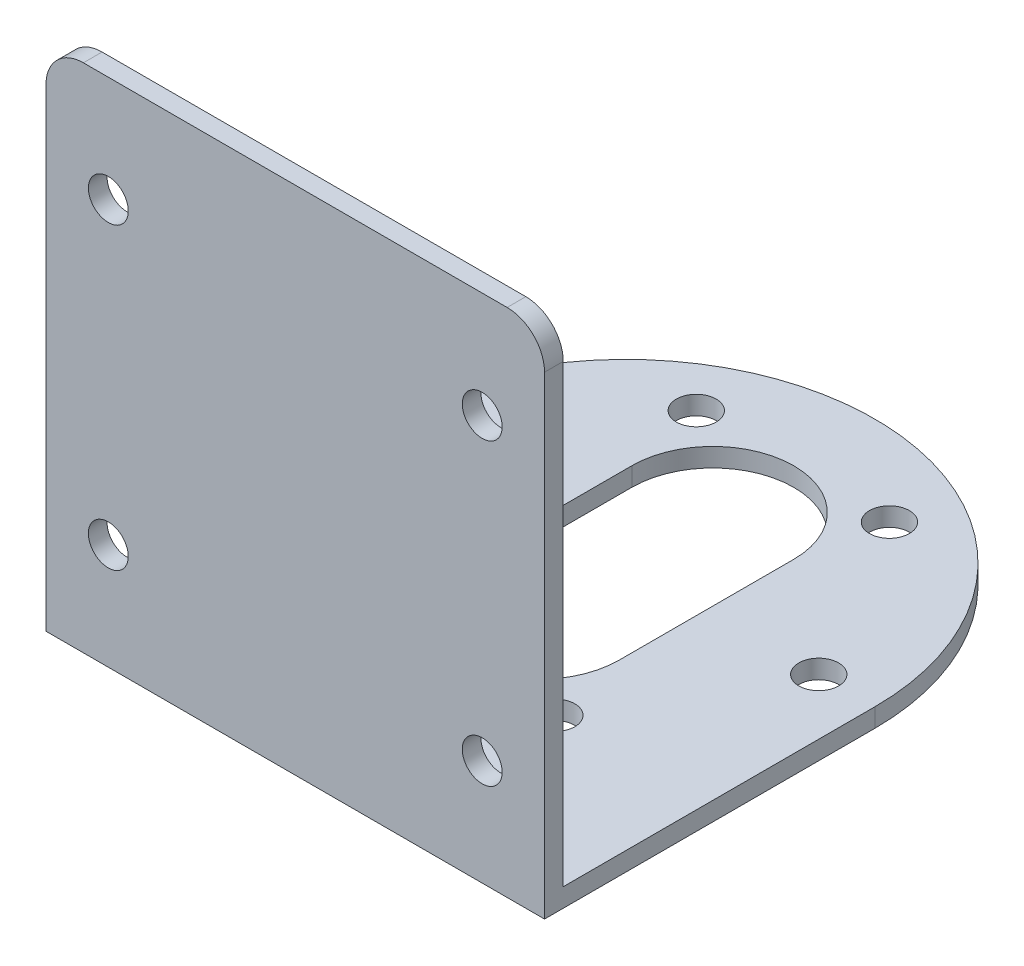
ISO-10303-21;
HEADER;
FILE_DESCRIPTION(('STEP AP214'),'2;1');
FILE_NAME('part.step','',(''),(''),'','','');
FILE_SCHEMA(('AUTOMOTIVE_DESIGN { 1 0 10303 214 1 1 1 1 }'));
ENDSEC;
DATA;
#1=APPLICATION_CONTEXT('core data for automotive mechanical design processes');
#2=APPLICATION_PROTOCOL_DEFINITION('international standard','automotive_design',2000,#1);
#3=PRODUCT_CONTEXT('',#1,'mechanical');
#4=PRODUCT('Part','Part','',(#3));
#5=PRODUCT_RELATED_PRODUCT_CATEGORY('part','',(#4));
#6=PRODUCT_DEFINITION_FORMATION('','',#4);
#7=PRODUCT_DEFINITION_CONTEXT('part definition',#1,'design');
#8=PRODUCT_DEFINITION('design','',#6,#7);
#9=PRODUCT_DEFINITION_SHAPE('','',#8);
#10=(LENGTH_UNIT() NAMED_UNIT(*) SI_UNIT(.MILLI.,.METRE.));
#11=(NAMED_UNIT(*) PLANE_ANGLE_UNIT() SI_UNIT($,.RADIAN.));
#12=(NAMED_UNIT(*) SI_UNIT($,.STERADIAN.) SOLID_ANGLE_UNIT());
#13=UNCERTAINTY_MEASURE_WITH_UNIT(LENGTH_MEASURE(1.E-05),#10,'distance_accuracy_value','');
#14=(GEOMETRIC_REPRESENTATION_CONTEXT(3) GLOBAL_UNCERTAINTY_ASSIGNED_CONTEXT((#13)) GLOBAL_UNIT_ASSIGNED_CONTEXT((#10,
#11,#12)) REPRESENTATION_CONTEXT('',''));
#15=CARTESIAN_POINT('',(0.,0.,0.));
#16=DIRECTION('',(0.,0.,1.));
#17=DIRECTION('',(1.,0.,0.));
#18=AXIS2_PLACEMENT_3D('',#15,#16,#17);
#19=CARTESIAN_POINT('',(0.,1.5,-13.25));
#20=DIRECTION('',(0.,1.,0.));
#21=DIRECTION('',(0.,0.,1.));
#22=AXIS2_PLACEMENT_3D('',#19,#20,#21);
#23=PLANE('',#22);
#24=DIRECTION('',(-1.,0.,0.));
#25=VECTOR('',#24,1.);
#26=CARTESIAN_POINT('',(-20.,1.5,11.75));
#27=LINE('',#26,#25);
#28=CARTESIAN_POINT('',(20.,1.5,11.75));
#29=VERTEX_POINT('',#28);
#30=CARTESIAN_POINT('',(-20.,1.5,11.75));
#31=VERTEX_POINT('',#30);
#32=EDGE_CURVE('E147',#29,#31,#27,.T.);
#33=ORIENTED_EDGE('',*,*,#32,.F.);
#34=DIRECTION('',(0.,0.,-1.));
#35=VECTOR('',#34,1.);
#36=CARTESIAN_POINT('',(20.,1.5,13.25));
#37=LINE('',#36,#35);
#38=CARTESIAN_POINT('',(20.,1.5,-13.25));
#39=VERTEX_POINT('',#38);
#40=EDGE_CURVE('E153',#29,#39,#37,.T.);
#41=ORIENTED_EDGE('',*,*,#40,.T.);
#42=CARTESIAN_POINT('',(0.,1.5,-13.25));
#43=DIRECTION('',(0.,1.,0.));
#44=DIRECTION('',(0.,0.,1.));
#45=AXIS2_PLACEMENT_3D('',#42,#43,#44);
#46=CIRCLE('',#45,20.);
#47=CARTESIAN_POINT('',(-20.,1.5,-13.25));
#48=VERTEX_POINT('',#47);
#49=EDGE_CURVE('E150',#39,#48,#46,.T.);
#50=ORIENTED_EDGE('',*,*,#49,.T.);
#51=DIRECTION('',(0.,0.,1.));
#52=VECTOR('',#51,1.);
#53=CARTESIAN_POINT('',(-20.,1.5,13.25));
#54=LINE('',#53,#52);
#55=EDGE_CURVE('E136',#48,#31,#54,.T.);
#56=ORIENTED_EDGE('',*,*,#55,.T.);
#57=EDGE_LOOP('',(#33,#41,#50,#56));
#58=FACE_BOUND('',#57,.T.);
#59=CARTESIAN_POINT('',(-7.75,1.5,-26.6733937586588));
#60=DIRECTION('',(0.,1.,0.));
#61=DIRECTION('',(0.,0.,1.));
#62=AXIS2_PLACEMENT_3D('',#59,#60,#61);
#63=CIRCLE('',#62,1.6);
#64=CARTESIAN_POINT('',(-7.75,1.5,-25.0733937586588));
#65=VERTEX_POINT('',#64);
#66=EDGE_CURVE('E180',#65,#65,#63,.T.);
#67=ORIENTED_EDGE('',*,*,#66,.F.);
#68=EDGE_LOOP('',(#67));
#69=FACE_BOUND('',#68,.T.);
#70=CARTESIAN_POINT('',(-7.74999999999999,1.5,0.1733937586588));
#71=DIRECTION('',(0.,1.,0.));
#72=DIRECTION('',(0.,0.,1.));
#73=AXIS2_PLACEMENT_3D('',#70,#71,#72);
#74=CIRCLE('',#73,1.6);
#75=CARTESIAN_POINT('',(-7.74999999999999,1.5,1.7733937586588));
#76=VERTEX_POINT('',#75);
#77=EDGE_CURVE('E196',#76,#76,#74,.T.);
#78=ORIENTED_EDGE('',*,*,#77,.F.);
#79=EDGE_LOOP('',(#78));
#80=FACE_BOUND('',#79,.T.);
#81=CARTESIAN_POINT('',(15.5,1.5,-13.25));
#82=DIRECTION('',(0.,1.,0.));
#83=DIRECTION('',(0.,0.,1.));
#84=AXIS2_PLACEMENT_3D('',#81,#82,#83);
#85=CIRCLE('',#84,1.6);
#86=CARTESIAN_POINT('',(15.5,1.5,-11.65));
#87=VERTEX_POINT('',#86);
#88=EDGE_CURVE('E212',#87,#87,#85,.T.);
#89=ORIENTED_EDGE('',*,*,#88,.F.);
#90=EDGE_LOOP('',(#89));
#91=FACE_BOUND('',#90,.T.);
#92=DIRECTION('',(0.,0.,1.));
#93=VECTOR('',#92,1.);
#94=CARTESIAN_POINT('',(-6.5,1.5,-20.25));
#95=LINE('',#94,#93);
#96=CARTESIAN_POINT('',(-6.5,1.5,-20.25));
#97=VERTEX_POINT('',#96);
#98=CARTESIAN_POINT('',(-6.5,1.5,-6.25));
#99=VERTEX_POINT('',#98);
#100=EDGE_CURVE('E223',#97,#99,#95,.T.);
#101=ORIENTED_EDGE('',*,*,#100,.F.);
#102=CARTESIAN_POINT('',(0.,1.5,-20.25));
#103=DIRECTION('',(0.,1.,0.));
#104=DIRECTION('',(0.,0.,1.));
#105=AXIS2_PLACEMENT_3D('',#102,#103,#104);
#106=CIRCLE('',#105,6.5);
#107=CARTESIAN_POINT('',(6.5,1.5,-20.25));
#108=VERTEX_POINT('',#107);
#109=EDGE_CURVE('E220',#108,#97,#106,.T.);
#110=ORIENTED_EDGE('',*,*,#109,.F.);
#111=DIRECTION('',(0.,0.,-1.));
#112=VECTOR('',#111,1.);
#113=CARTESIAN_POINT('',(6.5,1.5,-20.25));
#114=LINE('',#113,#112);
#115=CARTESIAN_POINT('',(6.5,1.5,-6.25));
#116=VERTEX_POINT('',#115);
#117=EDGE_CURVE('E231',#116,#108,#114,.T.);
#118=ORIENTED_EDGE('',*,*,#117,.F.);
#119=CARTESIAN_POINT('',(0.,1.5,-6.25));
#120=DIRECTION('',(0.,1.,0.));
#121=DIRECTION('',(0.,0.,-1.));
#122=AXIS2_PLACEMENT_3D('',#119,#120,#121);
#123=CIRCLE('',#122,6.5);
#124=EDGE_CURVE('E227',#99,#116,#123,.T.);
#125=ORIENTED_EDGE('',*,*,#124,.F.);
#126=EDGE_LOOP('',(#101,#110,#118,#125));
#127=FACE_BOUND('',#126,.T.);
#128=CARTESIAN_POINT('',(7.75000000000001,1.5,0.1733937586588));
#129=DIRECTION('',(0.,1.,0.));
#130=DIRECTION('',(0.,0.,1.));
#131=AXIS2_PLACEMENT_3D('',#128,#129,#130);
#132=CIRCLE('',#131,1.6);
#133=CARTESIAN_POINT('',(7.75000000000001,1.5,1.7733937586588));
#134=VERTEX_POINT('',#133);
#135=EDGE_CURVE('E204',#134,#134,#132,.T.);
#136=ORIENTED_EDGE('',*,*,#135,.F.);
#137=EDGE_LOOP('',(#136));
#138=FACE_BOUND('',#137,.T.);
#139=CARTESIAN_POINT('',(-15.5,1.5,-13.25));
#140=DIRECTION('',(0.,1.,0.));
#141=DIRECTION('',(0.,0.,1.));
#142=AXIS2_PLACEMENT_3D('',#139,#140,#141);
#143=CIRCLE('',#142,1.6);
#144=CARTESIAN_POINT('',(-15.5,1.5,-11.65));
#145=VERTEX_POINT('',#144);
#146=EDGE_CURVE('E188',#145,#145,#143,.T.);
#147=ORIENTED_EDGE('',*,*,#146,.F.);
#148=EDGE_LOOP('',(#147));
#149=FACE_BOUND('',#148,.T.);
#150=CARTESIAN_POINT('',(7.75,1.5,-26.6733937586588));
#151=DIRECTION('',(0.,1.,0.));
#152=DIRECTION('',(0.,0.,1.));
#153=AXIS2_PLACEMENT_3D('',#150,#151,#152);
#154=CIRCLE('',#153,1.6);
#155=CARTESIAN_POINT('',(7.75,1.5,-25.0733937586588));
#156=VERTEX_POINT('',#155);
#157=EDGE_CURVE('E172',#156,#156,#154,.T.);
#158=ORIENTED_EDGE('',*,*,#157,.F.);
#159=EDGE_LOOP('',(#158));
#160=FACE_BOUND('',#159,.T.);
#161=ADVANCED_FACE('F45',(#58,#69,#80,#91,#127,#138,#149,#160),#23,.T.);
#162=CARTESIAN_POINT('',(0.,0.,-13.25));
#163=DIRECTION('',(0.,1.,0.));
#164=DIRECTION('',(0.,0.,1.));
#165=AXIS2_PLACEMENT_3D('',#162,#163,#164);
#166=PLANE('',#165);
#167=CARTESIAN_POINT('',(0.,0.,-13.25));
#168=DIRECTION('',(0.,1.,0.));
#169=DIRECTION('',(0.,0.,1.));
#170=AXIS2_PLACEMENT_3D('',#167,#168,#169);
#171=CIRCLE('',#170,20.);
#172=CARTESIAN_POINT('',(20.,0.,-13.25));
#173=VERTEX_POINT('',#172);
#174=CARTESIAN_POINT('',(-20.,0.,-13.25));
#175=VERTEX_POINT('',#174);
#176=EDGE_CURVE('E262',#173,#175,#171,.T.);
#177=ORIENTED_EDGE('',*,*,#176,.F.);
#178=DIRECTION('',(0.,0.,-1.));
#179=VECTOR('',#178,1.);
#180=CARTESIAN_POINT('',(20.,0.,13.25));
#181=LINE('',#180,#179);
#182=CARTESIAN_POINT('',(20.,0.,13.25));
#183=VERTEX_POINT('',#182);
#184=EDGE_CURVE('E264',#183,#173,#181,.T.);
#185=ORIENTED_EDGE('',*,*,#184,.F.);
#186=DIRECTION('',(1.,0.,0.));
#187=VECTOR('',#186,1.);
#188=CARTESIAN_POINT('',(-20.,0.,13.25));
#189=LINE('',#188,#187);
#190=CARTESIAN_POINT('',(-20.,0.,13.25));
#191=VERTEX_POINT('',#190);
#192=EDGE_CURVE('E276',#191,#183,#189,.T.);
#193=ORIENTED_EDGE('',*,*,#192,.F.);
#194=DIRECTION('',(0.,0.,1.));
#195=VECTOR('',#194,1.);
#196=CARTESIAN_POINT('',(-20.,0.,13.25));
#197=LINE('',#196,#195);
#198=EDGE_CURVE('E272',#175,#191,#197,.T.);
#199=ORIENTED_EDGE('',*,*,#198,.F.);
#200=EDGE_LOOP('',(#177,#185,#193,#199));
#201=FACE_BOUND('',#200,.T.);
#202=CARTESIAN_POINT('',(0.,0.,-20.25));
#203=DIRECTION('',(0.,1.,0.));
#204=DIRECTION('',(0.,0.,1.));
#205=AXIS2_PLACEMENT_3D('',#202,#203,#204);
#206=CIRCLE('',#205,6.5);
#207=CARTESIAN_POINT('',(6.5,0.,-20.25));
#208=VERTEX_POINT('',#207);
#209=CARTESIAN_POINT('',(-6.5,0.,-20.25));
#210=VERTEX_POINT('',#209);
#211=EDGE_CURVE('E216',#208,#210,#206,.T.);
#212=ORIENTED_EDGE('',*,*,#211,.T.);
#213=DIRECTION('',(0.,0.,1.));
#214=VECTOR('',#213,1.);
#215=CARTESIAN_POINT('',(-6.5,0.,-20.25));
#216=LINE('',#215,#214);
#217=CARTESIAN_POINT('',(-6.5,0.,-6.25));
#218=VERTEX_POINT('',#217);
#219=EDGE_CURVE('E238',#210,#218,#216,.T.);
#220=ORIENTED_EDGE('',*,*,#219,.T.);
#221=CARTESIAN_POINT('',(0.,0.,-6.25));
#222=DIRECTION('',(0.,1.,0.));
#223=DIRECTION('',(0.,0.,-1.));
#224=AXIS2_PLACEMENT_3D('',#221,#222,#223);
#225=CIRCLE('',#224,6.5);
#226=CARTESIAN_POINT('',(6.5,0.,-6.25));
#227=VERTEX_POINT('',#226);
#228=EDGE_CURVE('E242',#218,#227,#225,.T.);
#229=ORIENTED_EDGE('',*,*,#228,.T.);
#230=DIRECTION('',(0.,0.,-1.));
#231=VECTOR('',#230,1.);
#232=CARTESIAN_POINT('',(6.5,0.,-20.25));
#233=LINE('',#232,#231);
#234=EDGE_CURVE('E224',#227,#208,#233,.T.);
#235=ORIENTED_EDGE('',*,*,#234,.T.);
#236=EDGE_LOOP('',(#212,#220,#229,#235));
#237=FACE_BOUND('',#236,.T.);
#238=CARTESIAN_POINT('',(15.5,0.,-13.25));
#239=DIRECTION('',(0.,1.,0.));
#240=DIRECTION('',(0.,0.,1.));
#241=AXIS2_PLACEMENT_3D('',#238,#239,#240);
#242=CIRCLE('',#241,1.6);
#243=CARTESIAN_POINT('',(15.5,0.,-11.65));
#244=VERTEX_POINT('',#243);
#245=EDGE_CURVE('E208',#244,#244,#242,.T.);
#246=ORIENTED_EDGE('',*,*,#245,.T.);
#247=EDGE_LOOP('',(#246));
#248=FACE_BOUND('',#247,.T.);
#249=CARTESIAN_POINT('',(7.75000000000001,0.,0.1733937586588));
#250=DIRECTION('',(0.,1.,0.));
#251=DIRECTION('',(0.,0.,1.));
#252=AXIS2_PLACEMENT_3D('',#249,#250,#251);
#253=CIRCLE('',#252,1.6);
#254=CARTESIAN_POINT('',(7.75000000000001,0.,1.7733937586588));
#255=VERTEX_POINT('',#254);
#256=EDGE_CURVE('E200',#255,#255,#253,.T.);
#257=ORIENTED_EDGE('',*,*,#256,.T.);
#258=EDGE_LOOP('',(#257));
#259=FACE_BOUND('',#258,.T.);
#260=CARTESIAN_POINT('',(-7.74999999999999,0.,0.1733937586588));
#261=DIRECTION('',(0.,1.,0.));
#262=DIRECTION('',(0.,0.,1.));
#263=AXIS2_PLACEMENT_3D('',#260,#261,#262);
#264=CIRCLE('',#263,1.6);
#265=CARTESIAN_POINT('',(-7.74999999999999,0.,1.7733937586588));
#266=VERTEX_POINT('',#265);
#267=EDGE_CURVE('E192',#266,#266,#264,.T.);
#268=ORIENTED_EDGE('',*,*,#267,.T.);
#269=EDGE_LOOP('',(#268));
#270=FACE_BOUND('',#269,.T.);
#271=CARTESIAN_POINT('',(-15.5,0.,-13.25));
#272=DIRECTION('',(0.,1.,0.));
#273=DIRECTION('',(0.,0.,1.));
#274=AXIS2_PLACEMENT_3D('',#271,#272,#273);
#275=CIRCLE('',#274,1.6);
#276=CARTESIAN_POINT('',(-15.5,0.,-11.65));
#277=VERTEX_POINT('',#276);
#278=EDGE_CURVE('E184',#277,#277,#275,.T.);
#279=ORIENTED_EDGE('',*,*,#278,.T.);
#280=EDGE_LOOP('',(#279));
#281=FACE_BOUND('',#280,.T.);
#282=CARTESIAN_POINT('',(-7.75,0.,-26.6733937586588));
#283=DIRECTION('',(0.,1.,0.));
#284=DIRECTION('',(0.,0.,1.));
#285=AXIS2_PLACEMENT_3D('',#282,#283,#284);
#286=CIRCLE('',#285,1.6);
#287=CARTESIAN_POINT('',(-7.75,0.,-25.0733937586588));
#288=VERTEX_POINT('',#287);
#289=EDGE_CURVE('E176',#288,#288,#286,.T.);
#290=ORIENTED_EDGE('',*,*,#289,.T.);
#291=EDGE_LOOP('',(#290));
#292=FACE_BOUND('',#291,.T.);
#293=CARTESIAN_POINT('',(7.75,0.,-26.6733937586588));
#294=DIRECTION('',(0.,1.,0.));
#295=DIRECTION('',(0.,0.,1.));
#296=AXIS2_PLACEMENT_3D('',#293,#294,#295);
#297=CIRCLE('',#296,1.6);
#298=CARTESIAN_POINT('',(7.75,0.,-25.0733937586588));
#299=VERTEX_POINT('',#298);
#300=EDGE_CURVE('E171',#299,#299,#297,.T.);
#301=ORIENTED_EDGE('',*,*,#300,.T.);
#302=EDGE_LOOP('',(#301));
#303=FACE_BOUND('',#302,.T.);
#304=ADVANCED_FACE('F327',(#201,#237,#248,#259,#270,#281,#292,#303),#166,.F.);
#305=CARTESIAN_POINT('',(0.,1.5,-13.25));
#306=DIRECTION('',(0.,-1.,0.));
#307=DIRECTION('',(0.,0.,-1.));
#308=AXIS2_PLACEMENT_3D('',#305,#306,#307);
#309=CYLINDRICAL_SURFACE('',#308,20.);
#310=ORIENTED_EDGE('',*,*,#176,.T.);
#311=DIRECTION('',(0.,-1.,0.));
#312=VECTOR('',#311,1.);
#313=CARTESIAN_POINT('',(-20.,1.5,-13.25));
#314=LINE('',#313,#312);
#315=EDGE_CURVE('E291',#48,#175,#314,.T.);
#316=ORIENTED_EDGE('',*,*,#315,.F.);
#317=ORIENTED_EDGE('',*,*,#49,.F.);
#318=DIRECTION('',(0.,-1.,0.));
#319=VECTOR('',#318,1.);
#320=CARTESIAN_POINT('',(20.,1.5,-13.25));
#321=LINE('',#320,#319);
#322=EDGE_CURVE('E268',#39,#173,#321,.T.);
#323=ORIENTED_EDGE('',*,*,#322,.T.);
#324=EDGE_LOOP('',(#310,#316,#317,#323));
#325=FACE_BOUND('',#324,.T.);
#326=ADVANCED_FACE('F337',(#325),#309,.T.);
#327=CARTESIAN_POINT('',(-20.,1.5,13.25));
#328=DIRECTION('',(1.,0.,0.));
#329=DIRECTION('',(0.,0.,-1.));
#330=AXIS2_PLACEMENT_3D('',#327,#328,#329);
#331=PLANE('',#330);
#332=DIRECTION('',(0.,-1.,0.));
#333=VECTOR('',#332,1.);
#334=CARTESIAN_POINT('',(-20.,1.5,13.25));
#335=LINE('',#334,#333);
#336=CARTESIAN_POINT('',(-20.,38.,13.25));
#337=VERTEX_POINT('',#336);
#338=EDGE_CURVE('E288',#337,#191,#335,.T.);
#339=ORIENTED_EDGE('',*,*,#338,.F.);
#340=DIRECTION('',(0.,0.,1.));
#341=VECTOR('',#340,1.);
#342=CARTESIAN_POINT('',(-20.,38.,13.25));
#343=LINE('',#342,#341);
#344=CARTESIAN_POINT('',(-20.,38.,11.75));
#345=VERTEX_POINT('',#344);
#346=EDGE_CURVE('E69',#337,#345,#343,.F.);
#347=ORIENTED_EDGE('',*,*,#346,.T.);
#348=DIRECTION('',(0.,-1.,0.));
#349=VECTOR('',#348,1.);
#350=CARTESIAN_POINT('',(-20.,41.,11.75));
#351=LINE('',#350,#349);
#352=EDGE_CURVE('E132',#345,#31,#351,.T.);
#353=ORIENTED_EDGE('',*,*,#352,.T.);
#354=ORIENTED_EDGE('',*,*,#55,.F.);
#355=ORIENTED_EDGE('',*,*,#315,.T.);
#356=ORIENTED_EDGE('',*,*,#198,.T.);
#357=EDGE_LOOP('',(#339,#347,#353,#354,#355,#356));
#358=FACE_BOUND('',#357,.T.);
#359=ADVANCED_FACE('F134',(#358),#331,.F.);
#360=CARTESIAN_POINT('',(-20.,1.5,13.25));
#361=DIRECTION('',(0.,0.,-1.));
#362=DIRECTION('',(-1.,0.,0.));
#363=AXIS2_PLACEMENT_3D('',#360,#361,#362);
#364=PLANE('',#363);
#365=CARTESIAN_POINT('',(-15.,8.5,13.25));
#366=DIRECTION('',(0.,0.,1.));
#367=DIRECTION('',(-1.,0.,0.));
#368=AXIS2_PLACEMENT_3D('',#365,#366,#367);
#369=CIRCLE('',#368,1.6);
#370=CARTESIAN_POINT('',(-13.4,8.5,13.25));
#371=VERTEX_POINT('',#370);
#372=EDGE_CURVE('E363',#371,#371,#369,.T.);
#373=ORIENTED_EDGE('',*,*,#372,.F.);
#374=EDGE_LOOP('',(#373));
#375=FACE_BOUND('',#374,.T.);
#376=CARTESIAN_POINT('',(15.,8.5,13.25));
#377=DIRECTION('',(0.,0.,1.));
#378=DIRECTION('',(1.,0.,0.));
#379=AXIS2_PLACEMENT_3D('',#376,#377,#378);
#380=CIRCLE('',#379,1.6);
#381=CARTESIAN_POINT('',(16.6,8.5,13.25));
#382=VERTEX_POINT('',#381);
#383=EDGE_CURVE('E367',#382,#382,#380,.T.);
#384=ORIENTED_EDGE('',*,*,#383,.F.);
#385=EDGE_LOOP('',(#384));
#386=FACE_BOUND('',#385,.T.);
#387=CARTESIAN_POINT('',(15.,32.5,13.25));
#388=DIRECTION('',(0.,0.,1.));
#389=DIRECTION('',(-1.,0.,0.));
#390=AXIS2_PLACEMENT_3D('',#387,#388,#389);
#391=CIRCLE('',#390,1.6);
#392=CARTESIAN_POINT('',(16.6,32.5,13.25));
#393=VERTEX_POINT('',#392);
#394=EDGE_CURVE('E371',#393,#393,#391,.T.);
#395=ORIENTED_EDGE('',*,*,#394,.F.);
#396=EDGE_LOOP('',(#395));
#397=FACE_BOUND('',#396,.T.);
#398=CARTESIAN_POINT('',(-15.,32.5,13.25));
#399=DIRECTION('',(0.,0.,1.));
#400=DIRECTION('',(1.,0.,0.));
#401=AXIS2_PLACEMENT_3D('',#398,#399,#400);
#402=CIRCLE('',#401,1.6);
#403=CARTESIAN_POINT('',(-13.4,32.5,13.25));
#404=VERTEX_POINT('',#403);
#405=EDGE_CURVE('E165',#404,#404,#402,.T.);
#406=ORIENTED_EDGE('',*,*,#405,.F.);
#407=EDGE_LOOP('',(#406));
#408=FACE_BOUND('',#407,.T.);
#409=DIRECTION('',(1.,0.,0.));
#410=VECTOR('',#409,1.);
#411=CARTESIAN_POINT('',(-20.,41.,13.25));
#412=LINE('',#411,#410);
#413=CARTESIAN_POINT('',(-17.,41.,13.25));
#414=VERTEX_POINT('',#413);
#415=CARTESIAN_POINT('',(17.,41.,13.25));
#416=VERTEX_POINT('',#415);
#417=EDGE_CURVE('E157',#414,#416,#412,.T.);
#418=ORIENTED_EDGE('',*,*,#417,.F.);
#419=CARTESIAN_POINT('',(-17.,38.,13.25));
#420=DIRECTION('',(0.,0.,-1.));
#421=DIRECTION('',(-1.,0.,0.));
#422=AXIS2_PLACEMENT_3D('',#419,#420,#421);
#423=CIRCLE('',#422,3.);
#424=EDGE_CURVE('E305',#414,#337,#423,.F.);
#425=ORIENTED_EDGE('',*,*,#424,.T.);
#426=ORIENTED_EDGE('',*,*,#338,.T.);
#427=ORIENTED_EDGE('',*,*,#192,.T.);
#428=DIRECTION('',(0.,-1.,0.));
#429=VECTOR('',#428,1.);
#430=CARTESIAN_POINT('',(20.,1.5,13.25));
#431=LINE('',#430,#429);
#432=CARTESIAN_POINT('',(20.,38.,13.25));
#433=VERTEX_POINT('',#432);
#434=EDGE_CURVE('E285',#433,#183,#431,.T.);
#435=ORIENTED_EDGE('',*,*,#434,.F.);
#436=CARTESIAN_POINT('',(17.,38.,13.25));
#437=DIRECTION('',(0.,0.,-1.));
#438=DIRECTION('',(-1.,0.,0.));
#439=AXIS2_PLACEMENT_3D('',#436,#437,#438);
#440=CIRCLE('',#439,3.);
#441=EDGE_CURVE('E302',#433,#416,#440,.F.);
#442=ORIENTED_EDGE('',*,*,#441,.T.);
#443=EDGE_LOOP('',(#418,#425,#426,#427,#435,#442));
#444=FACE_BOUND('',#443,.T.);
#445=ADVANCED_FACE('F322',(#375,#386,#397,#408,#444),#364,.F.);
#446=CARTESIAN_POINT('',(20.,1.5,13.25));
#447=DIRECTION('',(-1.,0.,0.));
#448=DIRECTION('',(0.,0.,1.));
#449=AXIS2_PLACEMENT_3D('',#446,#447,#448);
#450=PLANE('',#449);
#451=DIRECTION('',(0.,-1.,0.));
#452=VECTOR('',#451,1.);
#453=CARTESIAN_POINT('',(20.,41.,11.75));
#454=LINE('',#453,#452);
#455=CARTESIAN_POINT('',(20.,38.,11.75));
#456=VERTEX_POINT('',#455);
#457=EDGE_CURVE('E141',#456,#29,#454,.T.);
#458=ORIENTED_EDGE('',*,*,#457,.F.);
#459=DIRECTION('',(0.,0.,-1.));
#460=VECTOR('',#459,1.);
#461=CARTESIAN_POINT('',(20.,38.,13.25));
#462=LINE('',#461,#460);
#463=EDGE_CURVE('E11',#456,#433,#462,.F.);
#464=ORIENTED_EDGE('',*,*,#463,.T.);
#465=ORIENTED_EDGE('',*,*,#434,.T.);
#466=ORIENTED_EDGE('',*,*,#184,.T.);
#467=ORIENTED_EDGE('',*,*,#322,.F.);
#468=ORIENTED_EDGE('',*,*,#40,.F.);
#469=EDGE_LOOP('',(#458,#464,#465,#466,#467,#468));
#470=FACE_BOUND('',#469,.T.);
#471=ADVANCED_FACE('F334',(#470),#450,.F.);
#472=CARTESIAN_POINT('',(0.,1.5,-20.25));
#473=DIRECTION('',(0.,-1.,0.));
#474=DIRECTION('',(0.,0.,-1.));
#475=AXIS2_PLACEMENT_3D('',#472,#473,#474);
#476=CYLINDRICAL_SURFACE('',#475,6.5);
#477=ORIENTED_EDGE('',*,*,#211,.F.);
#478=DIRECTION('',(0.,-1.,0.));
#479=VECTOR('',#478,1.);
#480=CARTESIAN_POINT('',(6.5,1.5,-20.25));
#481=LINE('',#480,#479);
#482=EDGE_CURVE('E234',#108,#208,#481,.T.);
#483=ORIENTED_EDGE('',*,*,#482,.F.);
#484=ORIENTED_EDGE('',*,*,#109,.T.);
#485=DIRECTION('',(0.,-1.,0.));
#486=VECTOR('',#485,1.);
#487=CARTESIAN_POINT('',(-6.5,1.5,-20.25));
#488=LINE('',#487,#486);
#489=EDGE_CURVE('E258',#97,#210,#488,.T.);
#490=ORIENTED_EDGE('',*,*,#489,.T.);
#491=EDGE_LOOP('',(#477,#483,#484,#490));
#492=FACE_BOUND('',#491,.T.);
#493=ADVANCED_FACE('F351',(#492),#476,.F.);
#494=CARTESIAN_POINT('',(-6.5,1.5,-20.25));
#495=DIRECTION('',(1.,0.,0.));
#496=DIRECTION('',(0.,0.,-1.));
#497=AXIS2_PLACEMENT_3D('',#494,#495,#496);
#498=PLANE('',#497);
#499=ORIENTED_EDGE('',*,*,#219,.F.);
#500=ORIENTED_EDGE('',*,*,#489,.F.);
#501=ORIENTED_EDGE('',*,*,#100,.T.);
#502=DIRECTION('',(0.,-1.,0.));
#503=VECTOR('',#502,1.);
#504=CARTESIAN_POINT('',(-6.5,1.5,-6.25));
#505=LINE('',#504,#503);
#506=EDGE_CURVE('E255',#99,#218,#505,.T.);
#507=ORIENTED_EDGE('',*,*,#506,.T.);
#508=EDGE_LOOP('',(#499,#500,#501,#507));
#509=FACE_BOUND('',#508,.T.);
#510=ADVANCED_FACE('F450',(#509),#498,.T.);
#511=CARTESIAN_POINT('',(0.,1.5,-6.25));
#512=DIRECTION('',(0.,-1.,0.));
#513=DIRECTION('',(0.,0.,-1.));
#514=AXIS2_PLACEMENT_3D('',#511,#512,#513);
#515=CYLINDRICAL_SURFACE('',#514,6.5);
#516=ORIENTED_EDGE('',*,*,#228,.F.);
#517=ORIENTED_EDGE('',*,*,#506,.F.);
#518=ORIENTED_EDGE('',*,*,#124,.T.);
#519=DIRECTION('',(0.,-1.,0.));
#520=VECTOR('',#519,1.);
#521=CARTESIAN_POINT('',(6.5,1.5,-6.25));
#522=LINE('',#521,#520);
#523=EDGE_CURVE('E252',#116,#227,#522,.T.);
#524=ORIENTED_EDGE('',*,*,#523,.T.);
#525=EDGE_LOOP('',(#516,#517,#518,#524));
#526=FACE_BOUND('',#525,.T.);
#527=ADVANCED_FACE('F447',(#526),#515,.F.);
#528=CARTESIAN_POINT('',(6.5,1.5,-20.25));
#529=DIRECTION('',(-1.,0.,0.));
#530=DIRECTION('',(0.,0.,1.));
#531=AXIS2_PLACEMENT_3D('',#528,#529,#530);
#532=PLANE('',#531);
#533=ORIENTED_EDGE('',*,*,#234,.F.);
#534=ORIENTED_EDGE('',*,*,#523,.F.);
#535=ORIENTED_EDGE('',*,*,#117,.T.);
#536=ORIENTED_EDGE('',*,*,#482,.T.);
#537=EDGE_LOOP('',(#533,#534,#535,#536));
#538=FACE_BOUND('',#537,.T.);
#539=ADVANCED_FACE('F443',(#538),#532,.T.);
#540=CARTESIAN_POINT('',(15.5,1.5,-13.25));
#541=DIRECTION('',(0.,-1.,0.));
#542=DIRECTION('',(0.,0.,-1.));
#543=AXIS2_PLACEMENT_3D('',#540,#541,#542);
#544=CYLINDRICAL_SURFACE('',#543,1.6);
#545=ORIENTED_EDGE('',*,*,#88,.T.);
#546=EDGE_LOOP('',(#545));
#547=FACE_BOUND('',#546,.T.);
#548=ORIENTED_EDGE('',*,*,#245,.F.);
#549=EDGE_LOOP('',(#548));
#550=FACE_BOUND('',#549,.T.);
#551=ADVANCED_FACE('F439',(#547,#550),#544,.F.);
#552=CARTESIAN_POINT('',(7.75000000000001,1.5,0.1733937586588));
#553=DIRECTION('',(0.,-1.,0.));
#554=DIRECTION('',(0.,0.,-1.));
#555=AXIS2_PLACEMENT_3D('',#552,#553,#554);
#556=CYLINDRICAL_SURFACE('',#555,1.6);
#557=ORIENTED_EDGE('',*,*,#135,.T.);
#558=EDGE_LOOP('',(#557));
#559=FACE_BOUND('',#558,.T.);
#560=ORIENTED_EDGE('',*,*,#256,.F.);
#561=EDGE_LOOP('',(#560));
#562=FACE_BOUND('',#561,.T.);
#563=ADVANCED_FACE('F435',(#559,#562),#556,.F.);
#564=CARTESIAN_POINT('',(-7.74999999999999,1.5,0.1733937586588));
#565=DIRECTION('',(0.,-1.,0.));
#566=DIRECTION('',(0.,0.,-1.));
#567=AXIS2_PLACEMENT_3D('',#564,#565,#566);
#568=CYLINDRICAL_SURFACE('',#567,1.6);
#569=ORIENTED_EDGE('',*,*,#77,.T.);
#570=EDGE_LOOP('',(#569));
#571=FACE_BOUND('',#570,.T.);
#572=ORIENTED_EDGE('',*,*,#267,.F.);
#573=EDGE_LOOP('',(#572));
#574=FACE_BOUND('',#573,.T.);
#575=ADVANCED_FACE('F431',(#571,#574),#568,.F.);
#576=CARTESIAN_POINT('',(-15.5,1.5,-13.25));
#577=DIRECTION('',(0.,-1.,0.));
#578=DIRECTION('',(0.,0.,-1.));
#579=AXIS2_PLACEMENT_3D('',#576,#577,#578);
#580=CYLINDRICAL_SURFACE('',#579,1.6);
#581=ORIENTED_EDGE('',*,*,#146,.T.);
#582=EDGE_LOOP('',(#581));
#583=FACE_BOUND('',#582,.T.);
#584=ORIENTED_EDGE('',*,*,#278,.F.);
#585=EDGE_LOOP('',(#584));
#586=FACE_BOUND('',#585,.T.);
#587=ADVANCED_FACE('F427',(#583,#586),#580,.F.);
#588=CARTESIAN_POINT('',(-7.75,1.5,-26.6733937586588));
#589=DIRECTION('',(0.,-1.,0.));
#590=DIRECTION('',(0.,0.,-1.));
#591=AXIS2_PLACEMENT_3D('',#588,#589,#590);
#592=CYLINDRICAL_SURFACE('',#591,1.6);
#593=ORIENTED_EDGE('',*,*,#66,.T.);
#594=EDGE_LOOP('',(#593));
#595=FACE_BOUND('',#594,.T.);
#596=ORIENTED_EDGE('',*,*,#289,.F.);
#597=EDGE_LOOP('',(#596));
#598=FACE_BOUND('',#597,.T.);
#599=ADVANCED_FACE('F423',(#595,#598),#592,.F.);
#600=CARTESIAN_POINT('',(7.75,1.5,-26.6733937586588));
#601=DIRECTION('',(0.,-1.,0.));
#602=DIRECTION('',(0.,0.,-1.));
#603=AXIS2_PLACEMENT_3D('',#600,#601,#602);
#604=CYLINDRICAL_SURFACE('',#603,1.6);
#605=ORIENTED_EDGE('',*,*,#157,.T.);
#606=EDGE_LOOP('',(#605));
#607=FACE_BOUND('',#606,.T.);
#608=ORIENTED_EDGE('',*,*,#300,.F.);
#609=EDGE_LOOP('',(#608));
#610=FACE_BOUND('',#609,.T.);
#611=ADVANCED_FACE('F401',(#607,#610),#604,.F.);
#612=CARTESIAN_POINT('',(-20.,41.,11.75));
#613=DIRECTION('',(0.,0.,1.));
#614=DIRECTION('',(1.,0.,0.));
#615=AXIS2_PLACEMENT_3D('',#612,#613,#614);
#616=PLANE('',#615);
#617=CARTESIAN_POINT('',(-15.,8.5,11.75));
#618=DIRECTION('',(0.,0.,1.));
#619=DIRECTION('',(1.,0.,0.));
#620=AXIS2_PLACEMENT_3D('',#617,#618,#619);
#621=CIRCLE('',#620,1.6);
#622=CARTESIAN_POINT('',(-13.4,8.5,11.75));
#623=VERTEX_POINT('',#622);
#624=EDGE_CURVE('E384',#623,#623,#621,.F.);
#625=ORIENTED_EDGE('',*,*,#624,.F.);
#626=EDGE_LOOP('',(#625));
#627=FACE_BOUND('',#626,.T.);
#628=CARTESIAN_POINT('',(15.,8.5,11.75));
#629=DIRECTION('',(0.,0.,1.));
#630=DIRECTION('',(1.,0.,0.));
#631=AXIS2_PLACEMENT_3D('',#628,#629,#630);
#632=CIRCLE('',#631,1.6);
#633=CARTESIAN_POINT('',(16.6,8.5,11.75));
#634=VERTEX_POINT('',#633);
#635=EDGE_CURVE('E383',#634,#634,#632,.F.);
#636=ORIENTED_EDGE('',*,*,#635,.F.);
#637=EDGE_LOOP('',(#636));
#638=FACE_BOUND('',#637,.T.);
#639=CARTESIAN_POINT('',(15.,32.5,11.75));
#640=DIRECTION('',(0.,0.,1.));
#641=DIRECTION('',(1.,0.,0.));
#642=AXIS2_PLACEMENT_3D('',#639,#640,#641);
#643=CIRCLE('',#642,1.6);
#644=CARTESIAN_POINT('',(16.6,32.5,11.75));
#645=VERTEX_POINT('',#644);
#646=EDGE_CURVE('E378',#645,#645,#643,.F.);
#647=ORIENTED_EDGE('',*,*,#646,.F.);
#648=EDGE_LOOP('',(#647));
#649=FACE_BOUND('',#648,.T.);
#650=CARTESIAN_POINT('',(-15.,32.5,11.75));
#651=DIRECTION('',(0.,0.,1.));
#652=DIRECTION('',(1.,0.,0.));
#653=AXIS2_PLACEMENT_3D('',#650,#651,#652);
#654=CIRCLE('',#653,1.6);
#655=CARTESIAN_POINT('',(-13.4,32.5,11.75));
#656=VERTEX_POINT('',#655);
#657=EDGE_CURVE('E158',#656,#656,#654,.F.);
#658=ORIENTED_EDGE('',*,*,#657,.F.);
#659=EDGE_LOOP('',(#658));
#660=FACE_BOUND('',#659,.T.);
#661=ORIENTED_EDGE('',*,*,#352,.F.);
#662=CARTESIAN_POINT('',(-17.,38.,11.75));
#663=DIRECTION('',(0.,0.,1.));
#664=DIRECTION('',(1.,0.,0.));
#665=AXIS2_PLACEMENT_3D('',#662,#663,#664);
#666=CIRCLE('',#665,3.);
#667=CARTESIAN_POINT('',(-17.,41.,11.75));
#668=VERTEX_POINT('',#667);
#669=EDGE_CURVE('E54',#345,#668,#666,.F.);
#670=ORIENTED_EDGE('',*,*,#669,.T.);
#671=DIRECTION('',(-1.,0.,0.));
#672=VECTOR('',#671,1.);
#673=CARTESIAN_POINT('',(-20.,41.,11.75));
#674=LINE('',#673,#672);
#675=CARTESIAN_POINT('',(17.,41.,11.75));
#676=VERTEX_POINT('',#675);
#677=EDGE_CURVE('E142',#676,#668,#674,.T.);
#678=ORIENTED_EDGE('',*,*,#677,.F.);
#679=CARTESIAN_POINT('',(17.,38.,11.75));
#680=DIRECTION('',(0.,0.,1.));
#681=DIRECTION('',(1.,0.,0.));
#682=AXIS2_PLACEMENT_3D('',#679,#680,#681);
#683=CIRCLE('',#682,3.);
#684=EDGE_CURVE('E61',#676,#456,#683,.F.);
#685=ORIENTED_EDGE('',*,*,#684,.T.);
#686=ORIENTED_EDGE('',*,*,#457,.T.);
#687=ORIENTED_EDGE('',*,*,#32,.T.);
#688=EDGE_LOOP('',(#661,#670,#678,#685,#686,#687));
#689=FACE_BOUND('',#688,.T.);
#690=ADVANCED_FACE('F155',(#627,#638,#649,#660,#689),#616,.F.);
#691=CARTESIAN_POINT('',(0.,41.,0.));
#692=DIRECTION('',(0.,-1.,0.));
#693=DIRECTION('',(0.,0.,-1.));
#694=AXIS2_PLACEMENT_3D('',#691,#692,#693);
#695=PLANE('',#694);
#696=ORIENTED_EDGE('',*,*,#677,.T.);
#697=DIRECTION('',(0.,0.,1.));
#698=VECTOR('',#697,1.);
#699=CARTESIAN_POINT('',(-17.,41.,0.));
#700=LINE('',#699,#698);
#701=EDGE_CURVE('E298',#668,#414,#700,.T.);
#702=ORIENTED_EDGE('',*,*,#701,.T.);
#703=ORIENTED_EDGE('',*,*,#417,.T.);
#704=DIRECTION('',(0.,0.,-1.));
#705=VECTOR('',#704,1.);
#706=CARTESIAN_POINT('',(17.,41.,0.));
#707=LINE('',#706,#705);
#708=EDGE_CURVE('E294',#416,#676,#707,.T.);
#709=ORIENTED_EDGE('',*,*,#708,.T.);
#710=EDGE_LOOP('',(#696,#702,#703,#709));
#711=FACE_BOUND('',#710,.T.);
#712=ADVANCED_FACE('F316',(#711),#695,.F.);
#713=CARTESIAN_POINT('',(-15.,32.5,-33.251));
#714=DIRECTION('',(0.,0.,1.));
#715=DIRECTION('',(1.,0.,0.));
#716=AXIS2_PLACEMENT_3D('',#713,#714,#715);
#717=CYLINDRICAL_SURFACE('',#716,1.6);
#718=CARTESIAN_POINT('',(-13.4,32.5,13.25));
#719=CARTESIAN_POINT('',(-13.4,32.5,13.234375));
#720=CARTESIAN_POINT('',(-13.4,32.5,13.21875));
#721=CARTESIAN_POINT('',(-13.4,32.5,13.1875));
#722=CARTESIAN_POINT('',(-13.4,32.5,13.171875));
#723=CARTESIAN_POINT('',(-13.4,32.5,13.140625));
#724=CARTESIAN_POINT('',(-13.4,32.5,13.125));
#725=CARTESIAN_POINT('',(-13.4,32.5,13.09375));
#726=CARTESIAN_POINT('',(-13.4,32.5,13.078125));
#727=CARTESIAN_POINT('',(-13.4,32.5,13.046875));
#728=CARTESIAN_POINT('',(-13.4,32.5,13.03125));
#729=CARTESIAN_POINT('',(-13.4,32.5,13.));
#730=CARTESIAN_POINT('',(-13.4,32.5,12.984375));
#731=CARTESIAN_POINT('',(-13.4,32.5,12.953125));
#732=CARTESIAN_POINT('',(-13.4,32.5,12.9375));
#733=CARTESIAN_POINT('',(-13.4,32.5,12.90625));
#734=CARTESIAN_POINT('',(-13.4,32.5,12.890625));
#735=CARTESIAN_POINT('',(-13.4,32.5,12.859375));
#736=CARTESIAN_POINT('',(-13.4,32.5,12.84375));
#737=CARTESIAN_POINT('',(-13.4,32.5,12.8125));
#738=CARTESIAN_POINT('',(-13.4,32.5,12.796875));
#739=CARTESIAN_POINT('',(-13.4,32.5,12.765625));
#740=CARTESIAN_POINT('',(-13.4,32.5,12.75));
#741=CARTESIAN_POINT('',(-13.4,32.5,12.71875));
#742=CARTESIAN_POINT('',(-13.4,32.5,12.703125));
#743=CARTESIAN_POINT('',(-13.4,32.5,12.671875));
#744=CARTESIAN_POINT('',(-13.4,32.5,12.65625));
#745=CARTESIAN_POINT('',(-13.4,32.5,12.625));
#746=CARTESIAN_POINT('',(-13.4,32.5,12.609375));
#747=CARTESIAN_POINT('',(-13.4,32.5,12.578125));
#748=CARTESIAN_POINT('',(-13.4,32.5,12.5625));
#749=CARTESIAN_POINT('',(-13.4,32.5,12.53125));
#750=CARTESIAN_POINT('',(-13.4,32.5,12.515625));
#751=CARTESIAN_POINT('',(-13.4,32.5,12.484375));
#752=CARTESIAN_POINT('',(-13.4,32.5,12.46875));
#753=CARTESIAN_POINT('',(-13.4,32.5,12.4375));
#754=CARTESIAN_POINT('',(-13.4,32.5,12.421875));
#755=CARTESIAN_POINT('',(-13.4,32.5,12.390625));
#756=CARTESIAN_POINT('',(-13.4,32.5,12.375));
#757=CARTESIAN_POINT('',(-13.4,32.5,12.34375));
#758=CARTESIAN_POINT('',(-13.4,32.5,12.328125));
#759=CARTESIAN_POINT('',(-13.4,32.5,12.296875));
#760=CARTESIAN_POINT('',(-13.4,32.5,12.28125));
#761=CARTESIAN_POINT('',(-13.4,32.5,12.25));
#762=CARTESIAN_POINT('',(-13.4,32.5,12.234375));
#763=CARTESIAN_POINT('',(-13.4,32.5,12.203125));
#764=CARTESIAN_POINT('',(-13.4,32.5,12.1875));
#765=CARTESIAN_POINT('',(-13.4,32.5,12.15625));
#766=CARTESIAN_POINT('',(-13.4,32.5,12.140625));
#767=CARTESIAN_POINT('',(-13.4,32.5,12.109375));
#768=CARTESIAN_POINT('',(-13.4,32.5,12.09375));
#769=CARTESIAN_POINT('',(-13.4,32.5,12.0625));
#770=CARTESIAN_POINT('',(-13.4,32.5,12.046875));
#771=CARTESIAN_POINT('',(-13.4,32.5,12.015625));
#772=CARTESIAN_POINT('',(-13.4,32.5,12.));
#773=CARTESIAN_POINT('',(-13.4,32.5,11.96875));
#774=CARTESIAN_POINT('',(-13.4,32.5,11.953125));
#775=CARTESIAN_POINT('',(-13.4,32.5,11.921875));
#776=CARTESIAN_POINT('',(-13.4,32.5,11.90625));
#777=CARTESIAN_POINT('',(-13.4,32.5,11.875));
#778=CARTESIAN_POINT('',(-13.4,32.5,11.859375));
#779=CARTESIAN_POINT('',(-13.4,32.5,11.828125));
#780=CARTESIAN_POINT('',(-13.4,32.5,11.8125));
#781=CARTESIAN_POINT('',(-13.4,32.5,11.78125));
#782=CARTESIAN_POINT('',(-13.4,32.5,11.765625));
#783=CARTESIAN_POINT('',(-13.4,32.5,11.75));
#784=B_SPLINE_CURVE_WITH_KNOTS('',3,(#718,#719,#720,#721,#722,#723,#724,#725,#726,#727,#728,
#729,#730,#731,#732,#733,#734,#735,#736,#737,#738,#739,#740,#741,#742,#743,#744,#745,#746,#747,
#748,#749,#750,#751,#752,#753,#754,#755,#756,#757,#758,#759,#760,#761,#762,#763,#764,#765,#766,
#767,#768,#769,#770,#771,#772,#773,#774,#775,#776,#777,#778,#779,#780,#781,#782,#783),
.UNSPECIFIED.,.F.,.F.,(4,2,2,2,2,2,2,2,2,2,2,2,2,2,2,2,2,2,2,2,2,2,2,2,2,2,2,2,2,2,2,2,4),(0.,
0.0468750000000018,0.0937500000000036,0.140624999999998,0.1875,0.234375000000002,
0.281249999999997,0.328124999999999,0.375,0.421875000000002,0.468750000000004,0.515624999999999,
0.5625,0.609375000000002,0.656249999999997,0.703124999999999,0.750000000000001,
0.796875000000002,0.843750000000004,0.890624999999999,0.937500000000001,0.984375000000003,
1.03125,1.078125,1.125,1.171875,1.21875,1.265625,1.3125,1.359375,1.40625,1.453125,1.5),.UNSPECIFIED.);
#785=EDGE_CURVE('BSEAM406',#404,#656,#784,.T.);
#786=ORIENTED_EDGE('',*,*,#405,.T.);
#787=ORIENTED_EDGE('',*,*,#657,.T.);
#788=ORIENTED_EDGE('',*,*,#785,.T.);
#789=ORIENTED_EDGE('',*,*,#785,.F.);
#790=EDGE_LOOP('',(#786,#788,#787,#789));
#791=FACE_BOUND('',#790,.T.);
#792=ADVANCED_FACE('F406',(#791),#717,.F.);
#793=CARTESIAN_POINT('',(15.,32.5,-33.251));
#794=DIRECTION('',(0.,0.,1.));
#795=DIRECTION('',(1.,0.,0.));
#796=AXIS2_PLACEMENT_3D('',#793,#794,#795);
#797=CYLINDRICAL_SURFACE('',#796,1.6);
#798=CARTESIAN_POINT('',(16.6,32.5,13.25));
#799=CARTESIAN_POINT('',(16.6,32.5,13.234375));
#800=CARTESIAN_POINT('',(16.6,32.5,13.21875));
#801=CARTESIAN_POINT('',(16.6,32.5,13.1875));
#802=CARTESIAN_POINT('',(16.6,32.5,13.171875));
#803=CARTESIAN_POINT('',(16.6,32.5,13.140625));
#804=CARTESIAN_POINT('',(16.6,32.5,13.125));
#805=CARTESIAN_POINT('',(16.6,32.5,13.09375));
#806=CARTESIAN_POINT('',(16.6,32.5,13.078125));
#807=CARTESIAN_POINT('',(16.6,32.5,13.046875));
#808=CARTESIAN_POINT('',(16.6,32.5,13.03125));
#809=CARTESIAN_POINT('',(16.6,32.5,13.));
#810=CARTESIAN_POINT('',(16.6,32.5,12.984375));
#811=CARTESIAN_POINT('',(16.6,32.5,12.953125));
#812=CARTESIAN_POINT('',(16.6,32.5,12.9375));
#813=CARTESIAN_POINT('',(16.6,32.5,12.90625));
#814=CARTESIAN_POINT('',(16.6,32.5,12.890625));
#815=CARTESIAN_POINT('',(16.6,32.5,12.859375));
#816=CARTESIAN_POINT('',(16.6,32.5,12.84375));
#817=CARTESIAN_POINT('',(16.6,32.5,12.8125));
#818=CARTESIAN_POINT('',(16.6,32.5,12.796875));
#819=CARTESIAN_POINT('',(16.6,32.5,12.765625));
#820=CARTESIAN_POINT('',(16.6,32.5,12.75));
#821=CARTESIAN_POINT('',(16.6,32.5,12.71875));
#822=CARTESIAN_POINT('',(16.6,32.5,12.703125));
#823=CARTESIAN_POINT('',(16.6,32.5,12.671875));
#824=CARTESIAN_POINT('',(16.6,32.5,12.65625));
#825=CARTESIAN_POINT('',(16.6,32.5,12.625));
#826=CARTESIAN_POINT('',(16.6,32.5,12.609375));
#827=CARTESIAN_POINT('',(16.6,32.5,12.578125));
#828=CARTESIAN_POINT('',(16.6,32.5,12.5625));
#829=CARTESIAN_POINT('',(16.6,32.5,12.53125));
#830=CARTESIAN_POINT('',(16.6,32.5,12.515625));
#831=CARTESIAN_POINT('',(16.6,32.5,12.484375));
#832=CARTESIAN_POINT('',(16.6,32.5,12.46875));
#833=CARTESIAN_POINT('',(16.6,32.5,12.4375));
#834=CARTESIAN_POINT('',(16.6,32.5,12.421875));
#835=CARTESIAN_POINT('',(16.6,32.5,12.390625));
#836=CARTESIAN_POINT('',(16.6,32.5,12.375));
#837=CARTESIAN_POINT('',(16.6,32.5,12.34375));
#838=CARTESIAN_POINT('',(16.6,32.5,12.328125));
#839=CARTESIAN_POINT('',(16.6,32.5,12.296875));
#840=CARTESIAN_POINT('',(16.6,32.5,12.28125));
#841=CARTESIAN_POINT('',(16.6,32.5,12.25));
#842=CARTESIAN_POINT('',(16.6,32.5,12.234375));
#843=CARTESIAN_POINT('',(16.6,32.5,12.203125));
#844=CARTESIAN_POINT('',(16.6,32.5,12.1875));
#845=CARTESIAN_POINT('',(16.6,32.5,12.15625));
#846=CARTESIAN_POINT('',(16.6,32.5,12.140625));
#847=CARTESIAN_POINT('',(16.6,32.5,12.109375));
#848=CARTESIAN_POINT('',(16.6,32.5,12.09375));
#849=CARTESIAN_POINT('',(16.6,32.5,12.0625));
#850=CARTESIAN_POINT('',(16.6,32.5,12.046875));
#851=CARTESIAN_POINT('',(16.6,32.5,12.015625));
#852=CARTESIAN_POINT('',(16.6,32.5,12.));
#853=CARTESIAN_POINT('',(16.6,32.5,11.96875));
#854=CARTESIAN_POINT('',(16.6,32.5,11.953125));
#855=CARTESIAN_POINT('',(16.6,32.5,11.921875));
#856=CARTESIAN_POINT('',(16.6,32.5,11.90625));
#857=CARTESIAN_POINT('',(16.6,32.5,11.875));
#858=CARTESIAN_POINT('',(16.6,32.5,11.859375));
#859=CARTESIAN_POINT('',(16.6,32.5,11.828125));
#860=CARTESIAN_POINT('',(16.6,32.5,11.8125));
#861=CARTESIAN_POINT('',(16.6,32.5,11.78125));
#862=CARTESIAN_POINT('',(16.6,32.5,11.765625));
#863=CARTESIAN_POINT('',(16.6,32.5,11.75));
#864=B_SPLINE_CURVE_WITH_KNOTS('',3,(#798,#799,#800,#801,#802,#803,#804,#805,#806,#807,#808,
#809,#810,#811,#812,#813,#814,#815,#816,#817,#818,#819,#820,#821,#822,#823,#824,#825,#826,#827,
#828,#829,#830,#831,#832,#833,#834,#835,#836,#837,#838,#839,#840,#841,#842,#843,#844,#845,#846,
#847,#848,#849,#850,#851,#852,#853,#854,#855,#856,#857,#858,#859,#860,#861,#862,#863),
.UNSPECIFIED.,.F.,.F.,(4,2,2,2,2,2,2,2,2,2,2,2,2,2,2,2,2,2,2,2,2,2,2,2,2,2,2,2,2,2,2,2,4),(0.,
0.0468750000000018,0.0937500000000036,0.140624999999998,0.1875,0.234375000000002,
0.281249999999997,0.328124999999999,0.375,0.421875000000002,0.468750000000004,0.515624999999999,
0.5625,0.609375000000002,0.656249999999997,0.703124999999999,0.750000000000001,
0.796875000000002,0.843750000000004,0.890624999999999,0.937500000000001,0.984375000000003,
1.03125,1.078125,1.125,1.171875,1.21875,1.265625,1.3125,1.359375,1.40625,1.453125,1.5),.UNSPECIFIED.);
#865=EDGE_CURVE('BSEAM397',#393,#645,#864,.T.);
#866=ORIENTED_EDGE('',*,*,#394,.T.);
#867=ORIENTED_EDGE('',*,*,#646,.T.);
#868=ORIENTED_EDGE('',*,*,#865,.T.);
#869=ORIENTED_EDGE('',*,*,#865,.F.);
#870=EDGE_LOOP('',(#866,#868,#867,#869));
#871=FACE_BOUND('',#870,.T.);
#872=ADVANCED_FACE('F397',(#871),#797,.F.);
#873=CARTESIAN_POINT('',(15.,8.5,-33.251));
#874=DIRECTION('',(0.,0.,1.));
#875=DIRECTION('',(1.,0.,0.));
#876=AXIS2_PLACEMENT_3D('',#873,#874,#875);
#877=CYLINDRICAL_SURFACE('',#876,1.6);
#878=CARTESIAN_POINT('',(16.6,8.5,13.25));
#879=CARTESIAN_POINT('',(16.6,8.5,13.234375));
#880=CARTESIAN_POINT('',(16.6,8.5,13.21875));
#881=CARTESIAN_POINT('',(16.6,8.5,13.1875));
#882=CARTESIAN_POINT('',(16.6,8.5,13.171875));
#883=CARTESIAN_POINT('',(16.6,8.5,13.140625));
#884=CARTESIAN_POINT('',(16.6,8.5,13.125));
#885=CARTESIAN_POINT('',(16.6,8.5,13.09375));
#886=CARTESIAN_POINT('',(16.6,8.5,13.078125));
#887=CARTESIAN_POINT('',(16.6,8.5,13.046875));
#888=CARTESIAN_POINT('',(16.6,8.5,13.03125));
#889=CARTESIAN_POINT('',(16.6,8.5,13.));
#890=CARTESIAN_POINT('',(16.6,8.5,12.984375));
#891=CARTESIAN_POINT('',(16.6,8.5,12.953125));
#892=CARTESIAN_POINT('',(16.6,8.5,12.9375));
#893=CARTESIAN_POINT('',(16.6,8.5,12.90625));
#894=CARTESIAN_POINT('',(16.6,8.5,12.890625));
#895=CARTESIAN_POINT('',(16.6,8.5,12.859375));
#896=CARTESIAN_POINT('',(16.6,8.5,12.84375));
#897=CARTESIAN_POINT('',(16.6,8.5,12.8125));
#898=CARTESIAN_POINT('',(16.6,8.5,12.796875));
#899=CARTESIAN_POINT('',(16.6,8.5,12.765625));
#900=CARTESIAN_POINT('',(16.6,8.5,12.75));
#901=CARTESIAN_POINT('',(16.6,8.5,12.71875));
#902=CARTESIAN_POINT('',(16.6,8.5,12.703125));
#903=CARTESIAN_POINT('',(16.6,8.5,12.671875));
#904=CARTESIAN_POINT('',(16.6,8.5,12.65625));
#905=CARTESIAN_POINT('',(16.6,8.5,12.625));
#906=CARTESIAN_POINT('',(16.6,8.5,12.609375));
#907=CARTESIAN_POINT('',(16.6,8.5,12.578125));
#908=CARTESIAN_POINT('',(16.6,8.5,12.5625));
#909=CARTESIAN_POINT('',(16.6,8.5,12.53125));
#910=CARTESIAN_POINT('',(16.6,8.5,12.515625));
#911=CARTESIAN_POINT('',(16.6,8.5,12.484375));
#912=CARTESIAN_POINT('',(16.6,8.5,12.46875));
#913=CARTESIAN_POINT('',(16.6,8.5,12.4375));
#914=CARTESIAN_POINT('',(16.6,8.5,12.421875));
#915=CARTESIAN_POINT('',(16.6,8.5,12.390625));
#916=CARTESIAN_POINT('',(16.6,8.5,12.375));
#917=CARTESIAN_POINT('',(16.6,8.5,12.34375));
#918=CARTESIAN_POINT('',(16.6,8.5,12.328125));
#919=CARTESIAN_POINT('',(16.6,8.5,12.296875));
#920=CARTESIAN_POINT('',(16.6,8.5,12.28125));
#921=CARTESIAN_POINT('',(16.6,8.5,12.25));
#922=CARTESIAN_POINT('',(16.6,8.5,12.234375));
#923=CARTESIAN_POINT('',(16.6,8.5,12.203125));
#924=CARTESIAN_POINT('',(16.6,8.5,12.1875));
#925=CARTESIAN_POINT('',(16.6,8.5,12.15625));
#926=CARTESIAN_POINT('',(16.6,8.5,12.140625));
#927=CARTESIAN_POINT('',(16.6,8.5,12.109375));
#928=CARTESIAN_POINT('',(16.6,8.5,12.09375));
#929=CARTESIAN_POINT('',(16.6,8.5,12.0625));
#930=CARTESIAN_POINT('',(16.6,8.5,12.046875));
#931=CARTESIAN_POINT('',(16.6,8.5,12.015625));
#932=CARTESIAN_POINT('',(16.6,8.5,12.));
#933=CARTESIAN_POINT('',(16.6,8.5,11.96875));
#934=CARTESIAN_POINT('',(16.6,8.5,11.953125));
#935=CARTESIAN_POINT('',(16.6,8.5,11.921875));
#936=CARTESIAN_POINT('',(16.6,8.5,11.90625));
#937=CARTESIAN_POINT('',(16.6,8.5,11.875));
#938=CARTESIAN_POINT('',(16.6,8.5,11.859375));
#939=CARTESIAN_POINT('',(16.6,8.5,11.828125));
#940=CARTESIAN_POINT('',(16.6,8.5,11.8125));
#941=CARTESIAN_POINT('',(16.6,8.5,11.78125));
#942=CARTESIAN_POINT('',(16.6,8.5,11.765625));
#943=CARTESIAN_POINT('',(16.6,8.5,11.75));
#944=B_SPLINE_CURVE_WITH_KNOTS('',3,(#878,#879,#880,#881,#882,#883,#884,#885,#886,#887,#888,
#889,#890,#891,#892,#893,#894,#895,#896,#897,#898,#899,#900,#901,#902,#903,#904,#905,#906,#907,
#908,#909,#910,#911,#912,#913,#914,#915,#916,#917,#918,#919,#920,#921,#922,#923,#924,#925,#926,
#927,#928,#929,#930,#931,#932,#933,#934,#935,#936,#937,#938,#939,#940,#941,#942,#943),
.UNSPECIFIED.,.F.,.F.,(4,2,2,2,2,2,2,2,2,2,2,2,2,2,2,2,2,2,2,2,2,2,2,2,2,2,2,2,2,2,2,2,4),(0.,
0.0468750000000018,0.0937500000000036,0.140624999999998,0.1875,0.234375000000002,
0.281249999999997,0.328124999999999,0.375,0.421875000000002,0.468750000000004,0.515624999999999,
0.5625,0.609375000000002,0.656249999999997,0.703124999999999,0.750000000000001,
0.796875000000002,0.843750000000004,0.890624999999999,0.937500000000001,0.984375000000003,
1.03125,1.078125,1.125,1.171875,1.21875,1.265625,1.3125,1.359375,1.40625,1.453125,1.5),.UNSPECIFIED.);
#945=EDGE_CURVE('BSEAM413',#382,#634,#944,.T.);
#946=ORIENTED_EDGE('',*,*,#383,.T.);
#947=ORIENTED_EDGE('',*,*,#635,.T.);
#948=ORIENTED_EDGE('',*,*,#945,.T.);
#949=ORIENTED_EDGE('',*,*,#945,.F.);
#950=EDGE_LOOP('',(#946,#948,#947,#949));
#951=FACE_BOUND('',#950,.T.);
#952=ADVANCED_FACE('F413',(#951),#877,.F.);
#953=CARTESIAN_POINT('',(-15.,8.5,-33.251));
#954=DIRECTION('',(0.,0.,1.));
#955=DIRECTION('',(1.,0.,0.));
#956=AXIS2_PLACEMENT_3D('',#953,#954,#955);
#957=CYLINDRICAL_SURFACE('',#956,1.6);
#958=CARTESIAN_POINT('',(-13.4,8.5,13.25));
#959=CARTESIAN_POINT('',(-13.4,8.5,13.234375));
#960=CARTESIAN_POINT('',(-13.4,8.5,13.21875));
#961=CARTESIAN_POINT('',(-13.4,8.5,13.1875));
#962=CARTESIAN_POINT('',(-13.4,8.5,13.171875));
#963=CARTESIAN_POINT('',(-13.4,8.5,13.140625));
#964=CARTESIAN_POINT('',(-13.4,8.5,13.125));
#965=CARTESIAN_POINT('',(-13.4,8.5,13.09375));
#966=CARTESIAN_POINT('',(-13.4,8.5,13.078125));
#967=CARTESIAN_POINT('',(-13.4,8.5,13.046875));
#968=CARTESIAN_POINT('',(-13.4,8.5,13.03125));
#969=CARTESIAN_POINT('',(-13.4,8.5,13.));
#970=CARTESIAN_POINT('',(-13.4,8.5,12.984375));
#971=CARTESIAN_POINT('',(-13.4,8.5,12.953125));
#972=CARTESIAN_POINT('',(-13.4,8.5,12.9375));
#973=CARTESIAN_POINT('',(-13.4,8.5,12.90625));
#974=CARTESIAN_POINT('',(-13.4,8.5,12.890625));
#975=CARTESIAN_POINT('',(-13.4,8.5,12.859375));
#976=CARTESIAN_POINT('',(-13.4,8.5,12.84375));
#977=CARTESIAN_POINT('',(-13.4,8.5,12.8125));
#978=CARTESIAN_POINT('',(-13.4,8.5,12.796875));
#979=CARTESIAN_POINT('',(-13.4,8.5,12.765625));
#980=CARTESIAN_POINT('',(-13.4,8.5,12.75));
#981=CARTESIAN_POINT('',(-13.4,8.5,12.71875));
#982=CARTESIAN_POINT('',(-13.4,8.5,12.703125));
#983=CARTESIAN_POINT('',(-13.4,8.5,12.671875));
#984=CARTESIAN_POINT('',(-13.4,8.5,12.65625));
#985=CARTESIAN_POINT('',(-13.4,8.5,12.625));
#986=CARTESIAN_POINT('',(-13.4,8.5,12.609375));
#987=CARTESIAN_POINT('',(-13.4,8.5,12.578125));
#988=CARTESIAN_POINT('',(-13.4,8.5,12.5625));
#989=CARTESIAN_POINT('',(-13.4,8.5,12.53125));
#990=CARTESIAN_POINT('',(-13.4,8.5,12.515625));
#991=CARTESIAN_POINT('',(-13.4,8.5,12.484375));
#992=CARTESIAN_POINT('',(-13.4,8.5,12.46875));
#993=CARTESIAN_POINT('',(-13.4,8.5,12.4375));
#994=CARTESIAN_POINT('',(-13.4,8.5,12.421875));
#995=CARTESIAN_POINT('',(-13.4,8.5,12.390625));
#996=CARTESIAN_POINT('',(-13.4,8.5,12.375));
#997=CARTESIAN_POINT('',(-13.4,8.5,12.34375));
#998=CARTESIAN_POINT('',(-13.4,8.5,12.328125));
#999=CARTESIAN_POINT('',(-13.4,8.5,12.296875));
#1000=CARTESIAN_POINT('',(-13.4,8.5,12.28125));
#1001=CARTESIAN_POINT('',(-13.4,8.5,12.25));
#1002=CARTESIAN_POINT('',(-13.4,8.5,12.234375));
#1003=CARTESIAN_POINT('',(-13.4,8.5,12.203125));
#1004=CARTESIAN_POINT('',(-13.4,8.5,12.1875));
#1005=CARTESIAN_POINT('',(-13.4,8.5,12.15625));
#1006=CARTESIAN_POINT('',(-13.4,8.5,12.140625));
#1007=CARTESIAN_POINT('',(-13.4,8.5,12.109375));
#1008=CARTESIAN_POINT('',(-13.4,8.5,12.09375));
#1009=CARTESIAN_POINT('',(-13.4,8.5,12.0625));
#1010=CARTESIAN_POINT('',(-13.4,8.5,12.046875));
#1011=CARTESIAN_POINT('',(-13.4,8.5,12.015625));
#1012=CARTESIAN_POINT('',(-13.4,8.5,12.));
#1013=CARTESIAN_POINT('',(-13.4,8.5,11.96875));
#1014=CARTESIAN_POINT('',(-13.4,8.5,11.953125));
#1015=CARTESIAN_POINT('',(-13.4,8.5,11.921875));
#1016=CARTESIAN_POINT('',(-13.4,8.5,11.90625));
#1017=CARTESIAN_POINT('',(-13.4,8.5,11.875));
#1018=CARTESIAN_POINT('',(-13.4,8.5,11.859375));
#1019=CARTESIAN_POINT('',(-13.4,8.5,11.828125));
#1020=CARTESIAN_POINT('',(-13.4,8.5,11.8125));
#1021=CARTESIAN_POINT('',(-13.4,8.5,11.78125));
#1022=CARTESIAN_POINT('',(-13.4,8.5,11.765625));
#1023=CARTESIAN_POINT('',(-13.4,8.5,11.75));
#1024=B_SPLINE_CURVE_WITH_KNOTS('',3,(#958,#959,#960,#961,#962,#963,#964,#965,#966,#967,#968,
#969,#970,#971,#972,#973,#974,#975,#976,#977,#978,#979,#980,#981,#982,#983,#984,#985,#986,#987,
#988,#989,#990,#991,#992,#993,#994,#995,#996,#997,#998,#999,#1000,#1001,#1002,#1003,#1004,#1005,
#1006,#1007,#1008,#1009,#1010,#1011,#1012,#1013,#1014,#1015,#1016,#1017,#1018,#1019,#1020,#1021,
#1022,#1023),.UNSPECIFIED.,.F.,.F.,(4,2,2,2,2,2,2,2,2,2,2,2,2,2,2,2,2,2,2,2,2,2,2,2,2,2,2,2,2,2,
2,2,4),(0.,0.0468750000000018,0.0937500000000036,0.140624999999998,0.1875,0.234375000000002,
0.281249999999997,0.328124999999999,0.375,0.421875000000002,0.468750000000004,0.515624999999999,
0.5625,0.609375000000002,0.656249999999997,0.703124999999999,0.750000000000001,
0.796875000000002,0.843750000000004,0.890624999999999,0.937500000000001,0.984375000000003,
1.03125,1.078125,1.125,1.171875,1.21875,1.265625,1.3125,1.359375,1.40625,1.453125,1.5),.UNSPECIFIED.);
#1025=EDGE_CURVE('BSEAM418',#371,#623,#1024,.T.);
#1026=ORIENTED_EDGE('',*,*,#372,.T.);
#1027=ORIENTED_EDGE('',*,*,#624,.T.);
#1028=ORIENTED_EDGE('',*,*,#1025,.T.);
#1029=ORIENTED_EDGE('',*,*,#1025,.F.);
#1030=EDGE_LOOP('',(#1026,#1028,#1027,#1029));
#1031=FACE_BOUND('',#1030,.T.);
#1032=ADVANCED_FACE('F418',(#1031),#957,.F.);
#1033=CARTESIAN_POINT('',(-17.,38.,0.));
#1034=DIRECTION('',(0.,0.,1.));
#1035=DIRECTION('',(1.,0.,0.));
#1036=AXIS2_PLACEMENT_3D('',#1033,#1034,#1035);
#1037=CYLINDRICAL_SURFACE('',#1036,3.);
#1038=ORIENTED_EDGE('',*,*,#669,.F.);
#1039=ORIENTED_EDGE('',*,*,#346,.F.);
#1040=ORIENTED_EDGE('',*,*,#424,.F.);
#1041=ORIENTED_EDGE('',*,*,#701,.F.);
#1042=EDGE_LOOP('',(#1038,#1039,#1040,#1041));
#1043=FACE_BOUND('',#1042,.T.);
#1044=ADVANCED_FACE('F320',(#1043),#1037,.T.);
#1045=CARTESIAN_POINT('',(17.,38.,0.));
#1046=DIRECTION('',(0.,0.,-1.));
#1047=DIRECTION('',(-1.,0.,0.));
#1048=AXIS2_PLACEMENT_3D('',#1045,#1046,#1047);
#1049=CYLINDRICAL_SURFACE('',#1048,3.);
#1050=ORIENTED_EDGE('',*,*,#441,.F.);
#1051=ORIENTED_EDGE('',*,*,#463,.F.);
#1052=ORIENTED_EDGE('',*,*,#684,.F.);
#1053=ORIENTED_EDGE('',*,*,#708,.F.);
#1054=EDGE_LOOP('',(#1050,#1051,#1052,#1053));
#1055=FACE_BOUND('',#1054,.T.);
#1056=ADVANCED_FACE('F47',(#1055),#1049,.T.);
#1057=CLOSED_SHELL('',(#161,#304,#326,#359,#445,#471,#493,#510,#527,#539,#551,#563,#575,#587,
#599,#611,#690,#712,#792,#872,#952,#1032,#1044,#1056));
#1058=MANIFOLD_SOLID_BREP('B2',#1057);
#1059=ADVANCED_BREP_SHAPE_REPRESENTATION('',(#18,#1058),#14);
#1060=SHAPE_DEFINITION_REPRESENTATION(#9,#1059);
ENDSEC;
END-ISO-10303-21;
